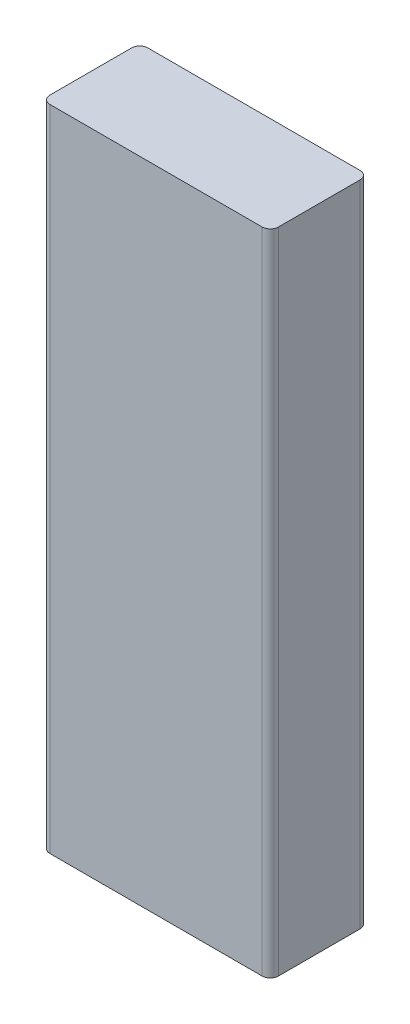
ISO-10303-21;
HEADER;
FILE_DESCRIPTION(('STEP AP214'),'2;1');
FILE_NAME('part.step','',(''),(''),'','','');
FILE_SCHEMA(('AUTOMOTIVE_DESIGN { 1 0 10303 214 1 1 1 1 }'));
ENDSEC;
DATA;
#1=APPLICATION_CONTEXT('core data for automotive mechanical design processes');
#2=APPLICATION_PROTOCOL_DEFINITION('international standard','automotive_design',2000,#1);
#3=PRODUCT_CONTEXT('',#1,'mechanical');
#4=PRODUCT('Part','Part','',(#3));
#5=PRODUCT_RELATED_PRODUCT_CATEGORY('part','',(#4));
#6=PRODUCT_DEFINITION_FORMATION('','',#4);
#7=PRODUCT_DEFINITION_CONTEXT('part definition',#1,'design');
#8=PRODUCT_DEFINITION('design','',#6,#7);
#9=PRODUCT_DEFINITION_SHAPE('','',#8);
#10=(LENGTH_UNIT() NAMED_UNIT(*) SI_UNIT(.MILLI.,.METRE.));
#11=(NAMED_UNIT(*) PLANE_ANGLE_UNIT() SI_UNIT($,.RADIAN.));
#12=(NAMED_UNIT(*) SI_UNIT($,.STERADIAN.) SOLID_ANGLE_UNIT());
#13=UNCERTAINTY_MEASURE_WITH_UNIT(LENGTH_MEASURE(1.E-05),#10,'distance_accuracy_value','');
#14=(GEOMETRIC_REPRESENTATION_CONTEXT(3) GLOBAL_UNCERTAINTY_ASSIGNED_CONTEXT((#13)) GLOBAL_UNIT_ASSIGNED_CONTEXT((#10,
#11,#12)) REPRESENTATION_CONTEXT('',''));
#15=CARTESIAN_POINT('',(0.,0.,0.));
#16=DIRECTION('',(0.,0.,1.));
#17=DIRECTION('',(1.,0.,0.));
#18=AXIS2_PLACEMENT_3D('',#15,#16,#17);
#19=CARTESIAN_POINT('',(44.45,252.4125,-19.05));
#20=DIRECTION('',(-1.,0.,0.));
#21=DIRECTION('',(0.,0.,1.));
#22=AXIS2_PLACEMENT_3D('',#19,#20,#21);
#23=PLANE('',#22);
#24=DIRECTION('',(0.,0.,-1.));
#25=VECTOR('',#24,1.);
#26=CARTESIAN_POINT('',(44.45,0.,-19.05));
#27=LINE('',#26,#25);
#28=CARTESIAN_POINT('',(44.45,0.,15.875));
#29=VERTEX_POINT('',#28);
#30=CARTESIAN_POINT('',(44.45,0.,-15.875));
#31=VERTEX_POINT('',#30);
#32=EDGE_CURVE('E157',#29,#31,#27,.T.);
#33=ORIENTED_EDGE('',*,*,#32,.T.);
#34=DIRECTION('',(0.,-1.,0.));
#35=VECTOR('',#34,1.);
#36=CARTESIAN_POINT('',(44.45,252.4125,-15.875));
#37=LINE('',#36,#35);
#38=CARTESIAN_POINT('',(44.45,252.4125,-15.875));
#39=VERTEX_POINT('',#38);
#40=EDGE_CURVE('E11',#31,#39,#37,.F.);
#41=ORIENTED_EDGE('',*,*,#40,.T.);
#42=DIRECTION('',(0.,0.,-1.));
#43=VECTOR('',#42,1.);
#44=CARTESIAN_POINT('',(44.45,252.4125,-19.05));
#45=LINE('',#44,#43);
#46=CARTESIAN_POINT('',(44.45,252.4125,15.875));
#47=VERTEX_POINT('',#46);
#48=EDGE_CURVE('E125',#47,#39,#45,.T.);
#49=ORIENTED_EDGE('',*,*,#48,.F.);
#50=DIRECTION('',(0.,-1.,0.));
#51=VECTOR('',#50,1.);
#52=CARTESIAN_POINT('',(44.45,252.4125,15.875));
#53=LINE('',#52,#51);
#54=EDGE_CURVE('E41',#47,#29,#53,.T.);
#55=ORIENTED_EDGE('',*,*,#54,.T.);
#56=EDGE_LOOP('',(#33,#41,#49,#55));
#57=FACE_BOUND('',#56,.T.);
#58=ADVANCED_FACE('F33',(#57),#23,.F.);
#59=CARTESIAN_POINT('',(-44.45,252.4125,-19.05));
#60=DIRECTION('',(0.,0.,1.));
#61=DIRECTION('',(1.,0.,0.));
#62=AXIS2_PLACEMENT_3D('',#59,#60,#61);
#63=PLANE('',#62);
#64=DIRECTION('',(-1.,0.,0.));
#65=VECTOR('',#64,1.);
#66=CARTESIAN_POINT('',(-44.45,0.,-19.05));
#67=LINE('',#66,#65);
#68=CARTESIAN_POINT('',(41.275,0.,-19.05));
#69=VERTEX_POINT('',#68);
#70=CARTESIAN_POINT('',(-41.275,0.,-19.05));
#71=VERTEX_POINT('',#70);
#72=EDGE_CURVE('E130',#69,#71,#67,.T.);
#73=ORIENTED_EDGE('',*,*,#72,.T.);
#74=DIRECTION('',(0.,-1.,0.));
#75=VECTOR('',#74,1.);
#76=CARTESIAN_POINT('',(-41.275,252.4125,-19.05));
#77=LINE('',#76,#75);
#78=CARTESIAN_POINT('',(-41.275,252.4125,-19.05));
#79=VERTEX_POINT('',#78);
#80=EDGE_CURVE('E48',#71,#79,#77,.F.);
#81=ORIENTED_EDGE('',*,*,#80,.T.);
#82=DIRECTION('',(-1.,0.,0.));
#83=VECTOR('',#82,1.);
#84=CARTESIAN_POINT('',(-44.45,252.4125,-19.05));
#85=LINE('',#84,#83);
#86=CARTESIAN_POINT('',(41.275,252.4125,-19.05));
#87=VERTEX_POINT('',#86);
#88=EDGE_CURVE('E128',#87,#79,#85,.T.);
#89=ORIENTED_EDGE('',*,*,#88,.F.);
#90=DIRECTION('',(0.,-1.,0.));
#91=VECTOR('',#90,1.);
#92=CARTESIAN_POINT('',(41.275,252.4125,-19.05));
#93=LINE('',#92,#91);
#94=EDGE_CURVE('E149',#87,#69,#93,.T.);
#95=ORIENTED_EDGE('',*,*,#94,.T.);
#96=EDGE_LOOP('',(#73,#81,#89,#95));
#97=FACE_BOUND('',#96,.T.);
#98=ADVANCED_FACE('F177',(#97),#63,.F.);
#99=CARTESIAN_POINT('',(-44.45,252.4125,-19.05));
#100=DIRECTION('',(1.,0.,0.));
#101=DIRECTION('',(0.,0.,-1.));
#102=AXIS2_PLACEMENT_3D('',#99,#100,#101);
#103=PLANE('',#102);
#104=DIRECTION('',(0.,0.,1.));
#105=VECTOR('',#104,1.);
#106=CARTESIAN_POINT('',(-44.45,0.,-19.05));
#107=LINE('',#106,#105);
#108=CARTESIAN_POINT('',(-44.45,0.,-15.875));
#109=VERTEX_POINT('',#108);
#110=CARTESIAN_POINT('',(-44.45,0.,15.875));
#111=VERTEX_POINT('',#110);
#112=EDGE_CURVE('E126',#109,#111,#107,.T.);
#113=ORIENTED_EDGE('',*,*,#112,.T.);
#114=DIRECTION('',(0.,-1.,0.));
#115=VECTOR('',#114,1.);
#116=CARTESIAN_POINT('',(-44.45,252.4125,15.875));
#117=LINE('',#116,#115);
#118=CARTESIAN_POINT('',(-44.45,252.4125,15.875));
#119=VERTEX_POINT('',#118);
#120=EDGE_CURVE('E104',#111,#119,#117,.F.);
#121=ORIENTED_EDGE('',*,*,#120,.T.);
#122=DIRECTION('',(0.,0.,1.));
#123=VECTOR('',#122,1.);
#124=CARTESIAN_POINT('',(-44.45,252.4125,-19.05));
#125=LINE('',#124,#123);
#126=CARTESIAN_POINT('',(-44.45,252.4125,-15.875));
#127=VERTEX_POINT('',#126);
#128=EDGE_CURVE('E165',#127,#119,#125,.T.);
#129=ORIENTED_EDGE('',*,*,#128,.F.);
#130=DIRECTION('',(0.,-1.,0.));
#131=VECTOR('',#130,1.);
#132=CARTESIAN_POINT('',(-44.45,252.4125,-15.875));
#133=LINE('',#132,#131);
#134=EDGE_CURVE('E109',#127,#109,#133,.T.);
#135=ORIENTED_EDGE('',*,*,#134,.T.);
#136=EDGE_LOOP('',(#113,#121,#129,#135));
#137=FACE_BOUND('',#136,.T.);
#138=ADVANCED_FACE('F176',(#137),#103,.F.);
#139=CARTESIAN_POINT('',(-44.45,252.4125,19.05));
#140=DIRECTION('',(0.,0.,-1.));
#141=DIRECTION('',(-1.,0.,0.));
#142=AXIS2_PLACEMENT_3D('',#139,#140,#141);
#143=PLANE('',#142);
#144=DIRECTION('',(1.,0.,0.));
#145=VECTOR('',#144,1.);
#146=CARTESIAN_POINT('',(-44.45,252.4125,19.05));
#147=LINE('',#146,#145);
#148=CARTESIAN_POINT('',(-41.275,252.4125,19.05));
#149=VERTEX_POINT('',#148);
#150=CARTESIAN_POINT('',(41.275,252.4125,19.05));
#151=VERTEX_POINT('',#150);
#152=EDGE_CURVE('E119',#149,#151,#147,.T.);
#153=ORIENTED_EDGE('',*,*,#152,.F.);
#154=DIRECTION('',(0.,-1.,0.));
#155=VECTOR('',#154,1.);
#156=CARTESIAN_POINT('',(-41.275,252.4125,19.05));
#157=LINE('',#156,#155);
#158=CARTESIAN_POINT('',(-41.275,0.,19.05));
#159=VERTEX_POINT('',#158);
#160=EDGE_CURVE('E103',#149,#159,#157,.T.);
#161=ORIENTED_EDGE('',*,*,#160,.T.);
#162=DIRECTION('',(1.,0.,0.));
#163=VECTOR('',#162,1.);
#164=CARTESIAN_POINT('',(-44.45,0.,19.05));
#165=LINE('',#164,#163);
#166=CARTESIAN_POINT('',(41.275,0.,19.05));
#167=VERTEX_POINT('',#166);
#168=EDGE_CURVE('E116',#159,#167,#165,.T.);
#169=ORIENTED_EDGE('',*,*,#168,.T.);
#170=DIRECTION('',(0.,-1.,0.));
#171=VECTOR('',#170,1.);
#172=CARTESIAN_POINT('',(41.275,252.4125,19.05));
#173=LINE('',#172,#171);
#174=EDGE_CURVE('E121',#167,#151,#173,.F.);
#175=ORIENTED_EDGE('',*,*,#174,.T.);
#176=EDGE_LOOP('',(#153,#161,#169,#175));
#177=FACE_BOUND('',#176,.T.);
#178=ADVANCED_FACE('F115',(#177),#143,.F.);
#179=CARTESIAN_POINT('',(0.,252.4125,0.));
#180=DIRECTION('',(0.,1.,0.));
#181=DIRECTION('',(0.,0.,1.));
#182=AXIS2_PLACEMENT_3D('',#179,#180,#181);
#183=PLANE('',#182);
#184=ORIENTED_EDGE('',*,*,#128,.T.);
#185=CARTESIAN_POINT('',(-41.275,252.4125,15.875));
#186=DIRECTION('',(0.,1.,0.));
#187=DIRECTION('',(0.,0.,1.));
#188=AXIS2_PLACEMENT_3D('',#185,#186,#187);
#189=CIRCLE('',#188,3.175);
#190=EDGE_CURVE('E147',#119,#149,#189,.T.);
#191=ORIENTED_EDGE('',*,*,#190,.T.);
#192=ORIENTED_EDGE('',*,*,#152,.T.);
#193=CARTESIAN_POINT('',(41.275,252.4125,15.875));
#194=DIRECTION('',(0.,1.,0.));
#195=DIRECTION('',(0.,0.,1.));
#196=AXIS2_PLACEMENT_3D('',#193,#194,#195);
#197=CIRCLE('',#196,3.175);
#198=EDGE_CURVE('E142',#151,#47,#197,.T.);
#199=ORIENTED_EDGE('',*,*,#198,.T.);
#200=ORIENTED_EDGE('',*,*,#48,.T.);
#201=CARTESIAN_POINT('',(41.275,252.4125,-15.875));
#202=DIRECTION('',(0.,1.,0.));
#203=DIRECTION('',(0.,0.,1.));
#204=AXIS2_PLACEMENT_3D('',#201,#202,#203);
#205=CIRCLE('',#204,3.175);
#206=EDGE_CURVE('E55',#39,#87,#205,.T.);
#207=ORIENTED_EDGE('',*,*,#206,.T.);
#208=ORIENTED_EDGE('',*,*,#88,.T.);
#209=CARTESIAN_POINT('',(-41.275,252.4125,-15.875));
#210=DIRECTION('',(0.,1.,0.));
#211=DIRECTION('',(0.,0.,1.));
#212=AXIS2_PLACEMENT_3D('',#209,#210,#211);
#213=CIRCLE('',#212,3.175);
#214=EDGE_CURVE('E145',#79,#127,#213,.T.);
#215=ORIENTED_EDGE('',*,*,#214,.T.);
#216=EDGE_LOOP('',(#184,#191,#192,#199,#200,#207,#208,#215));
#217=FACE_BOUND('',#216,.T.);
#218=ADVANCED_FACE('F169',(#217),#183,.T.);
#219=CARTESIAN_POINT('',(0.,0.,0.));
#220=DIRECTION('',(0.,1.,0.));
#221=DIRECTION('',(0.,0.,1.));
#222=AXIS2_PLACEMENT_3D('',#219,#220,#221);
#223=PLANE('',#222);
#224=ORIENTED_EDGE('',*,*,#168,.F.);
#225=CARTESIAN_POINT('',(-41.275,0.,15.875));
#226=DIRECTION('',(0.,1.,0.));
#227=DIRECTION('',(0.,0.,1.));
#228=AXIS2_PLACEMENT_3D('',#225,#226,#227);
#229=CIRCLE('',#228,3.175);
#230=EDGE_CURVE('E99',#159,#111,#229,.F.);
#231=ORIENTED_EDGE('',*,*,#230,.T.);
#232=ORIENTED_EDGE('',*,*,#112,.F.);
#233=CARTESIAN_POINT('',(-41.275,0.,-15.875));
#234=DIRECTION('',(0.,1.,0.));
#235=DIRECTION('',(0.,0.,1.));
#236=AXIS2_PLACEMENT_3D('',#233,#234,#235);
#237=CIRCLE('',#236,3.175);
#238=EDGE_CURVE('E110',#109,#71,#237,.F.);
#239=ORIENTED_EDGE('',*,*,#238,.T.);
#240=ORIENTED_EDGE('',*,*,#72,.F.);
#241=CARTESIAN_POINT('',(41.275,0.,-15.875));
#242=DIRECTION('',(0.,1.,0.));
#243=DIRECTION('',(0.,0.,1.));
#244=AXIS2_PLACEMENT_3D('',#241,#242,#243);
#245=CIRCLE('',#244,3.175);
#246=EDGE_CURVE('E136',#69,#31,#245,.F.);
#247=ORIENTED_EDGE('',*,*,#246,.T.);
#248=ORIENTED_EDGE('',*,*,#32,.F.);
#249=CARTESIAN_POINT('',(41.275,0.,15.875));
#250=DIRECTION('',(0.,1.,0.));
#251=DIRECTION('',(0.,0.,1.));
#252=AXIS2_PLACEMENT_3D('',#249,#250,#251);
#253=CIRCLE('',#252,3.175);
#254=EDGE_CURVE('E120',#29,#167,#253,.F.);
#255=ORIENTED_EDGE('',*,*,#254,.T.);
#256=EDGE_LOOP('',(#224,#231,#232,#239,#240,#247,#248,#255));
#257=FACE_BOUND('',#256,.T.);
#258=ADVANCED_FACE('F123',(#257),#223,.F.);
#259=CARTESIAN_POINT('',(-41.275,252.4125,15.875));
#260=DIRECTION('',(0.,-1.,0.));
#261=DIRECTION('',(0.,0.,-1.));
#262=AXIS2_PLACEMENT_3D('',#259,#260,#261);
#263=CYLINDRICAL_SURFACE('',#262,3.175);
#264=ORIENTED_EDGE('',*,*,#190,.F.);
#265=ORIENTED_EDGE('',*,*,#120,.F.);
#266=ORIENTED_EDGE('',*,*,#230,.F.);
#267=ORIENTED_EDGE('',*,*,#160,.F.);
#268=EDGE_LOOP('',(#264,#265,#266,#267));
#269=FACE_BOUND('',#268,.T.);
#270=ADVANCED_FACE('F102',(#269),#263,.T.);
#271=CARTESIAN_POINT('',(-41.275,252.4125,-15.875));
#272=DIRECTION('',(0.,-1.,0.));
#273=DIRECTION('',(0.,0.,-1.));
#274=AXIS2_PLACEMENT_3D('',#271,#272,#273);
#275=CYLINDRICAL_SURFACE('',#274,3.175);
#276=ORIENTED_EDGE('',*,*,#214,.F.);
#277=ORIENTED_EDGE('',*,*,#80,.F.);
#278=ORIENTED_EDGE('',*,*,#238,.F.);
#279=ORIENTED_EDGE('',*,*,#134,.F.);
#280=EDGE_LOOP('',(#276,#277,#278,#279));
#281=FACE_BOUND('',#280,.T.);
#282=ADVANCED_FACE('F174',(#281),#275,.T.);
#283=CARTESIAN_POINT('',(41.275,252.4125,-15.875));
#284=DIRECTION('',(0.,-1.,0.));
#285=DIRECTION('',(0.,0.,-1.));
#286=AXIS2_PLACEMENT_3D('',#283,#284,#285);
#287=CYLINDRICAL_SURFACE('',#286,3.175);
#288=ORIENTED_EDGE('',*,*,#206,.F.);
#289=ORIENTED_EDGE('',*,*,#40,.F.);
#290=ORIENTED_EDGE('',*,*,#246,.F.);
#291=ORIENTED_EDGE('',*,*,#94,.F.);
#292=EDGE_LOOP('',(#288,#289,#290,#291));
#293=FACE_BOUND('',#292,.T.);
#294=ADVANCED_FACE('F179',(#293),#287,.T.);
#295=CARTESIAN_POINT('',(41.275,252.4125,15.875));
#296=DIRECTION('',(0.,-1.,0.));
#297=DIRECTION('',(0.,0.,-1.));
#298=AXIS2_PLACEMENT_3D('',#295,#296,#297);
#299=CYLINDRICAL_SURFACE('',#298,3.175);
#300=ORIENTED_EDGE('',*,*,#198,.F.);
#301=ORIENTED_EDGE('',*,*,#174,.F.);
#302=ORIENTED_EDGE('',*,*,#254,.F.);
#303=ORIENTED_EDGE('',*,*,#54,.F.);
#304=EDGE_LOOP('',(#300,#301,#302,#303));
#305=FACE_BOUND('',#304,.T.);
#306=ADVANCED_FACE('F35',(#305),#299,.T.);
#307=CLOSED_SHELL('',(#58,#98,#138,#178,#218,#258,#270,#282,#294,#306));
#308=MANIFOLD_SOLID_BREP('B2',#307);
#309=ADVANCED_BREP_SHAPE_REPRESENTATION('',(#18,#308),#14);
#310=SHAPE_DEFINITION_REPRESENTATION(#9,#309);
ENDSEC;
END-ISO-10303-21;
